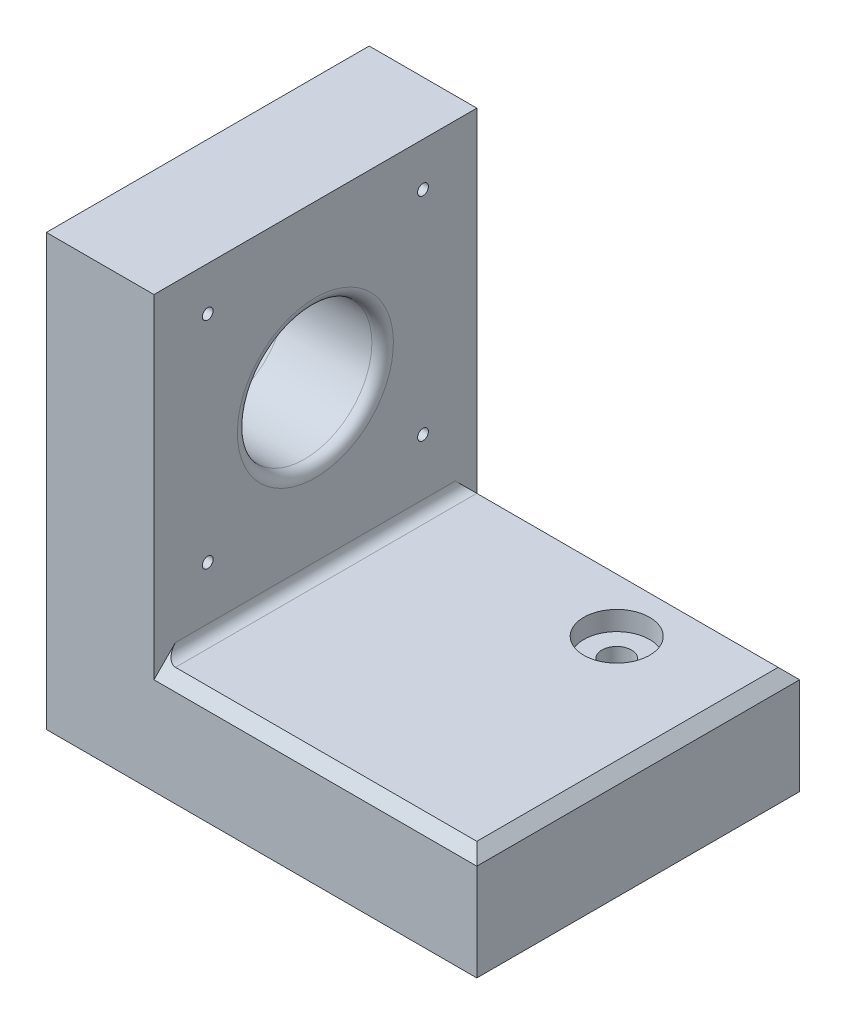
ISO-10303-21;
HEADER;
FILE_DESCRIPTION(('STEP AP214'),'2;1');
FILE_NAME('part.step','',(''),(''),'','','');
FILE_SCHEMA(('AUTOMOTIVE_DESIGN { 1 0 10303 214 1 1 1 1 }'));
ENDSEC;
DATA;
#1=APPLICATION_CONTEXT('core data for automotive mechanical design processes');
#2=APPLICATION_PROTOCOL_DEFINITION('international standard','automotive_design',2000,#1);
#3=PRODUCT_CONTEXT('',#1,'mechanical');
#4=PRODUCT('Part','Part','',(#3));
#5=PRODUCT_RELATED_PRODUCT_CATEGORY('part','',(#4));
#6=PRODUCT_DEFINITION_FORMATION('','',#4);
#7=PRODUCT_DEFINITION_CONTEXT('part definition',#1,'design');
#8=PRODUCT_DEFINITION('design','',#6,#7);
#9=PRODUCT_DEFINITION_SHAPE('','',#8);
#10=(LENGTH_UNIT() NAMED_UNIT(*) SI_UNIT(.MILLI.,.METRE.));
#11=(NAMED_UNIT(*) PLANE_ANGLE_UNIT() SI_UNIT($,.RADIAN.));
#12=(NAMED_UNIT(*) SI_UNIT($,.STERADIAN.) SOLID_ANGLE_UNIT());
#13=UNCERTAINTY_MEASURE_WITH_UNIT(LENGTH_MEASURE(1.E-05),#10,'distance_accuracy_value','');
#14=(GEOMETRIC_REPRESENTATION_CONTEXT(3) GLOBAL_UNCERTAINTY_ASSIGNED_CONTEXT((#13)) GLOBAL_UNIT_ASSIGNED_CONTEXT((#10,
#11,#12)) REPRESENTATION_CONTEXT('',''));
#15=CARTESIAN_POINT('',(0.,0.,0.));
#16=DIRECTION('',(0.,0.,1.));
#17=DIRECTION('',(1.,0.,0.));
#18=AXIS2_PLACEMENT_3D('',#15,#16,#17);
#19=CARTESIAN_POINT('',(80.,0.,-60.));
#20=DIRECTION('',(0.,-1.,0.));
#21=DIRECTION('',(1.,0.,0.));
#22=AXIS2_PLACEMENT_3D('',#19,#20,#21);
#23=PLANE('',#22);
#24=CARTESIAN_POINT('',(58.,0.,-48.));
#25=DIRECTION('',(0.,1.,0.));
#26=DIRECTION('',(0.,0.,1.));
#27=AXIS2_PLACEMENT_3D('',#24,#25,#26);
#28=CIRCLE('',#27,2.75);
#29=CARTESIAN_POINT('',(58.,0.,-45.25));
#30=VERTEX_POINT('',#29);
#31=EDGE_CURVE('E490',#30,#30,#28,.T.);
#32=ORIENTED_EDGE('',*,*,#31,.T.);
#33=EDGE_LOOP('',(#32));
#34=FACE_BOUND('',#33,.T.);
#35=DIRECTION('',(1.,0.,0.));
#36=VECTOR('',#35,1.);
#37=CARTESIAN_POINT('',(80.,0.,0.));
#38=LINE('',#37,#36);
#39=CARTESIAN_POINT('',(0.,0.,0.));
#40=VERTEX_POINT('',#39);
#41=CARTESIAN_POINT('',(80.,0.,0.));
#42=VERTEX_POINT('',#41);
#43=EDGE_CURVE('E142',#40,#42,#38,.T.);
#44=ORIENTED_EDGE('',*,*,#43,.F.);
#45=DIRECTION('',(0.,0.,1.));
#46=VECTOR('',#45,1.);
#47=CARTESIAN_POINT('',(0.,0.,-60.));
#48=LINE('',#47,#46);
#49=CARTESIAN_POINT('',(0.,0.,-60.));
#50=VERTEX_POINT('',#49);
#51=EDGE_CURVE('E156',#50,#40,#48,.T.);
#52=ORIENTED_EDGE('',*,*,#51,.F.);
#53=DIRECTION('',(1.,0.,0.));
#54=VECTOR('',#53,1.);
#55=CARTESIAN_POINT('',(80.,0.,-60.));
#56=LINE('',#55,#54);
#57=CARTESIAN_POINT('',(80.,0.,-60.));
#58=VERTEX_POINT('',#57);
#59=EDGE_CURVE('E155',#50,#58,#56,.T.);
#60=ORIENTED_EDGE('',*,*,#59,.T.);
#61=DIRECTION('',(0.,0.,1.));
#62=VECTOR('',#61,1.);
#63=CARTESIAN_POINT('',(80.,0.,-60.));
#64=LINE('',#63,#62);
#65=EDGE_CURVE('E163',#58,#42,#64,.T.);
#66=ORIENTED_EDGE('',*,*,#65,.T.);
#67=EDGE_LOOP('',(#44,#52,#60,#66));
#68=FACE_BOUND('',#67,.T.);
#69=ADVANCED_FACE('F39',(#34,#68),#23,.T.);
#70=CARTESIAN_POINT('',(0.,0.,-60.));
#71=DIRECTION('',(-1.,0.,0.));
#72=DIRECTION('',(0.,0.,1.));
#73=AXIS2_PLACEMENT_3D('',#70,#71,#72);
#74=PLANE('',#73);
#75=CARTESIAN_POINT('',(0.,50.,-30.));
#76=DIRECTION('',(-1.,0.,0.));
#77=DIRECTION('',(0.,0.,1.));
#78=AXIS2_PLACEMENT_3D('',#75,#76,#77);
#79=CIRCLE('',#78,14.5);
#80=CARTESIAN_POINT('',(0.,50.,-15.5));
#81=VERTEX_POINT('',#80);
#82=EDGE_CURVE('E158',#81,#81,#79,.F.);
#83=ORIENTED_EDGE('',*,*,#82,.T.);
#84=EDGE_LOOP('',(#83));
#85=FACE_BOUND('',#84,.T.);
#86=DIRECTION('',(0.,-1.,0.));
#87=VECTOR('',#86,1.);
#88=CARTESIAN_POINT('',(0.,0.,0.));
#89=LINE('',#88,#87);
#90=CARTESIAN_POINT('',(0.,80.,0.));
#91=VERTEX_POINT('',#90);
#92=EDGE_CURVE('E153',#91,#40,#89,.T.);
#93=ORIENTED_EDGE('',*,*,#92,.F.);
#94=DIRECTION('',(0.,0.,1.));
#95=VECTOR('',#94,1.);
#96=CARTESIAN_POINT('',(0.,80.,-60.));
#97=LINE('',#96,#95);
#98=CARTESIAN_POINT('',(0.,80.,-60.));
#99=VERTEX_POINT('',#98);
#100=EDGE_CURVE('E159',#99,#91,#97,.T.);
#101=ORIENTED_EDGE('',*,*,#100,.F.);
#102=DIRECTION('',(0.,-1.,0.));
#103=VECTOR('',#102,1.);
#104=CARTESIAN_POINT('',(0.,0.,-60.));
#105=LINE('',#104,#103);
#106=EDGE_CURVE('E165',#99,#50,#105,.T.);
#107=ORIENTED_EDGE('',*,*,#106,.T.);
#108=ORIENTED_EDGE('',*,*,#51,.T.);
#109=EDGE_LOOP('',(#93,#101,#107,#108));
#110=FACE_BOUND('',#109,.T.);
#111=ADVANCED_FACE('F236',(#85,#110),#74,.T.);
#112=CARTESIAN_POINT('',(0.,80.,-60.));
#113=DIRECTION('',(0.,1.,0.));
#114=DIRECTION('',(0.,0.,1.));
#115=AXIS2_PLACEMENT_3D('',#112,#113,#114);
#116=PLANE('',#115);
#117=DIRECTION('',(-1.,0.,0.));
#118=VECTOR('',#117,1.);
#119=CARTESIAN_POINT('',(0.,80.,0.));
#120=LINE('',#119,#118);
#121=CARTESIAN_POINT('',(20.,80.,0.));
#122=VERTEX_POINT('',#121);
#123=EDGE_CURVE('E145',#122,#91,#120,.T.);
#124=ORIENTED_EDGE('',*,*,#123,.F.);
#125=DIRECTION('',(0.,0.,1.));
#126=VECTOR('',#125,1.);
#127=CARTESIAN_POINT('',(20.,80.,-60.));
#128=LINE('',#127,#126);
#129=CARTESIAN_POINT('',(20.,80.,-60.));
#130=VERTEX_POINT('',#129);
#131=EDGE_CURVE('E161',#130,#122,#128,.T.);
#132=ORIENTED_EDGE('',*,*,#131,.F.);
#133=DIRECTION('',(-1.,0.,0.));
#134=VECTOR('',#133,1.);
#135=CARTESIAN_POINT('',(0.,80.,-60.));
#136=LINE('',#135,#134);
#137=EDGE_CURVE('E230',#130,#99,#136,.T.);
#138=ORIENTED_EDGE('',*,*,#137,.T.);
#139=ORIENTED_EDGE('',*,*,#100,.T.);
#140=EDGE_LOOP('',(#124,#132,#138,#139));
#141=FACE_BOUND('',#140,.T.);
#142=ADVANCED_FACE('F244',(#141),#116,.T.);
#143=CARTESIAN_POINT('',(20.,80.,-60.));
#144=DIRECTION('',(1.,0.,0.));
#145=DIRECTION('',(0.,1.,0.));
#146=AXIS2_PLACEMENT_3D('',#143,#144,#145);
#147=PLANE('',#146);
#148=CARTESIAN_POINT('',(20.,50.,-30.));
#149=DIRECTION('',(1.,0.,0.));
#150=DIRECTION('',(0.,1.,0.));
#151=AXIS2_PLACEMENT_3D('',#148,#149,#150);
#152=CIRCLE('',#151,14.5);
#153=CARTESIAN_POINT('',(20.,64.5,-30.));
#154=VERTEX_POINT('',#153);
#155=EDGE_CURVE('E174',#154,#154,#152,.F.);
#156=ORIENTED_EDGE('',*,*,#155,.T.);
#157=EDGE_LOOP('',(#156));
#158=FACE_BOUND('',#157,.T.);
#159=CARTESIAN_POINT('',(20.,71.900619729754,-10.));
#160=DIRECTION('',(1.,0.,0.));
#161=DIRECTION('',(0.,0.,-1.));
#162=AXIS2_PLACEMENT_3D('',#159,#160,#161);
#163=CIRCLE('',#162,1.);
#164=CARTESIAN_POINT('',(20.,71.900619729754,-11.));
#165=VERTEX_POINT('',#164);
#166=EDGE_CURVE('E208',#165,#165,#163,.T.);
#167=ORIENTED_EDGE('',*,*,#166,.F.);
#168=EDGE_LOOP('',(#167));
#169=FACE_BOUND('',#168,.T.);
#170=CARTESIAN_POINT('',(20.,32.4695679521847,-50.));
#171=DIRECTION('',(1.,0.,0.));
#172=DIRECTION('',(0.,0.,-1.));
#173=AXIS2_PLACEMENT_3D('',#170,#171,#172);
#174=CIRCLE('',#173,0.999999999999998);
#175=CARTESIAN_POINT('',(20.,32.4695679521847,-51.));
#176=VERTEX_POINT('',#175);
#177=EDGE_CURVE('E207',#176,#176,#174,.T.);
#178=ORIENTED_EDGE('',*,*,#177,.F.);
#179=EDGE_LOOP('',(#178));
#180=FACE_BOUND('',#179,.T.);
#181=CARTESIAN_POINT('',(20.,31.900619729754,-10.));
#182=DIRECTION('',(1.,0.,0.));
#183=DIRECTION('',(0.,0.,-1.));
#184=AXIS2_PLACEMENT_3D('',#181,#182,#183);
#185=CIRCLE('',#184,1.);
#186=CARTESIAN_POINT('',(20.,31.900619729754,-11.));
#187=VERTEX_POINT('',#186);
#188=EDGE_CURVE('E195',#187,#187,#185,.T.);
#189=ORIENTED_EDGE('',*,*,#188,.F.);
#190=EDGE_LOOP('',(#189));
#191=FACE_BOUND('',#190,.T.);
#192=CARTESIAN_POINT('',(20.,71.900619729754,-50.));
#193=DIRECTION('',(1.,0.,0.));
#194=DIRECTION('',(0.,0.,-1.));
#195=AXIS2_PLACEMENT_3D('',#192,#193,#194);
#196=CIRCLE('',#195,0.999999999999998);
#197=CARTESIAN_POINT('',(20.,71.900619729754,-51.));
#198=VERTEX_POINT('',#197);
#199=EDGE_CURVE('E215',#198,#198,#196,.T.);
#200=ORIENTED_EDGE('',*,*,#199,.F.);
#201=EDGE_LOOP('',(#200));
#202=FACE_BOUND('',#201,.T.);
#203=DIRECTION('',(0.,0.707106781186547,-0.707106781186548));
#204=VECTOR('',#203,1.);
#205=CARTESIAN_POINT('',(20.,20.,-2.));
#206=LINE('',#205,#204);
#207=CARTESIAN_POINT('',(20.,18.,0.));
#208=VERTEX_POINT('',#207);
#209=CARTESIAN_POINT('',(20.,22.,-4.));
#210=VERTEX_POINT('',#209);
#211=EDGE_CURVE('E54',#208,#210,#206,.T.);
#212=ORIENTED_EDGE('',*,*,#211,.T.);
#213=DIRECTION('',(0.,0.,1.));
#214=VECTOR('',#213,1.);
#215=CARTESIAN_POINT('',(20.,22.,-58.));
#216=LINE('',#215,#214);
#217=CARTESIAN_POINT('',(20.,22.,-56.));
#218=VERTEX_POINT('',#217);
#219=EDGE_CURVE('E180',#210,#218,#216,.F.);
#220=ORIENTED_EDGE('',*,*,#219,.T.);
#221=DIRECTION('',(0.,-0.707106781186547,-0.707106781186548));
#222=VECTOR('',#221,1.);
#223=CARTESIAN_POINT('',(20.,20.,-58.));
#224=LINE('',#223,#222);
#225=CARTESIAN_POINT('',(20.,18.,-60.));
#226=VERTEX_POINT('',#225);
#227=EDGE_CURVE('E62',#218,#226,#224,.T.);
#228=ORIENTED_EDGE('',*,*,#227,.T.);
#229=DIRECTION('',(0.,1.,0.));
#230=VECTOR('',#229,1.);
#231=CARTESIAN_POINT('',(20.,80.,-60.));
#232=LINE('',#231,#230);
#233=EDGE_CURVE('E227',#226,#130,#232,.T.);
#234=ORIENTED_EDGE('',*,*,#233,.T.);
#235=ORIENTED_EDGE('',*,*,#131,.T.);
#236=DIRECTION('',(0.,1.,0.));
#237=VECTOR('',#236,1.);
#238=CARTESIAN_POINT('',(20.,80.,0.));
#239=LINE('',#238,#237);
#240=EDGE_CURVE('E143',#208,#122,#239,.T.);
#241=ORIENTED_EDGE('',*,*,#240,.F.);
#242=EDGE_LOOP('',(#212,#220,#228,#234,#235,#241));
#243=FACE_BOUND('',#242,.T.);
#244=ADVANCED_FACE('F245',(#158,#169,#180,#191,#202,#243),#147,.T.);
#245=CARTESIAN_POINT('',(20.,20.,-60.));
#246=DIRECTION('',(0.,1.,0.));
#247=DIRECTION('',(0.,0.,1.));
#248=AXIS2_PLACEMENT_3D('',#245,#246,#247);
#249=PLANE('',#248);
#250=CARTESIAN_POINT('',(58.,20.,-48.));
#251=DIRECTION('',(0.,1.,0.));
#252=DIRECTION('',(0.,0.,1.));
#253=AXIS2_PLACEMENT_3D('',#250,#251,#252);
#254=CIRCLE('',#253,6.12);
#255=CARTESIAN_POINT('',(58.,20.,-54.12));
#256=VERTEX_POINT('',#255);
#257=EDGE_CURVE('E491',#256,#256,#254,.T.);
#258=ORIENTED_EDGE('',*,*,#257,.F.);
#259=EDGE_LOOP('',(#258));
#260=FACE_BOUND('',#259,.T.);
#261=DIRECTION('',(0.,0.,1.));
#262=VECTOR('',#261,1.);
#263=CARTESIAN_POINT('',(78.,20.,-60.));
#264=LINE('',#263,#262);
#265=CARTESIAN_POINT('',(78.,20.,-58.));
#266=VERTEX_POINT('',#265);
#267=CARTESIAN_POINT('',(78.,20.,-2.));
#268=VERTEX_POINT('',#267);
#269=EDGE_CURVE('E115',#266,#268,#264,.T.);
#270=ORIENTED_EDGE('',*,*,#269,.F.);
#271=DIRECTION('',(1.,0.,0.));
#272=VECTOR('',#271,1.);
#273=CARTESIAN_POINT('',(20.,20.,-58.));
#274=LINE('',#273,#272);
#275=CARTESIAN_POINT('',(22.,20.,-58.));
#276=VERTEX_POINT('',#275);
#277=EDGE_CURVE('E187',#276,#266,#274,.T.);
#278=ORIENTED_EDGE('',*,*,#277,.F.);
#279=DIRECTION('',(0.,0.,1.));
#280=VECTOR('',#279,1.);
#281=CARTESIAN_POINT('',(22.,20.,-2.));
#282=LINE('',#281,#280);
#283=CARTESIAN_POINT('',(22.,20.,-2.));
#284=VERTEX_POINT('',#283);
#285=EDGE_CURVE('E177',#276,#284,#282,.T.);
#286=ORIENTED_EDGE('',*,*,#285,.T.);
#287=DIRECTION('',(1.,0.,0.));
#288=VECTOR('',#287,1.);
#289=CARTESIAN_POINT('',(20.,20.,-2.));
#290=LINE('',#289,#288);
#291=EDGE_CURVE('E137',#284,#268,#290,.T.);
#292=ORIENTED_EDGE('',*,*,#291,.T.);
#293=EDGE_LOOP('',(#270,#278,#286,#292));
#294=FACE_BOUND('',#293,.T.);
#295=ADVANCED_FACE('F192',(#260,#294),#249,.T.);
#296=CARTESIAN_POINT('',(80.,20.,-60.));
#297=DIRECTION('',(1.,0.,0.));
#298=DIRECTION('',(0.,0.,-1.));
#299=AXIS2_PLACEMENT_3D('',#296,#297,#298);
#300=PLANE('',#299);
#301=DIRECTION('',(0.,0.,1.));
#302=VECTOR('',#301,1.);
#303=CARTESIAN_POINT('',(80.,18.,-60.));
#304=LINE('',#303,#302);
#305=CARTESIAN_POINT('',(80.,18.,-60.));
#306=VERTEX_POINT('',#305);
#307=CARTESIAN_POINT('',(80.,18.,0.));
#308=VERTEX_POINT('',#307);
#309=EDGE_CURVE('E113',#306,#308,#304,.T.);
#310=ORIENTED_EDGE('',*,*,#309,.T.);
#311=DIRECTION('',(0.,1.,0.));
#312=VECTOR('',#311,1.);
#313=CARTESIAN_POINT('',(80.,20.,0.));
#314=LINE('',#313,#312);
#315=EDGE_CURVE('E126',#42,#308,#314,.T.);
#316=ORIENTED_EDGE('',*,*,#315,.F.);
#317=ORIENTED_EDGE('',*,*,#65,.F.);
#318=DIRECTION('',(0.,1.,0.));
#319=VECTOR('',#318,1.);
#320=CARTESIAN_POINT('',(80.,20.,-60.));
#321=LINE('',#320,#319);
#322=EDGE_CURVE('E129',#58,#306,#321,.T.);
#323=ORIENTED_EDGE('',*,*,#322,.T.);
#324=EDGE_LOOP('',(#310,#316,#317,#323));
#325=FACE_BOUND('',#324,.T.);
#326=ADVANCED_FACE('F124',(#325),#300,.T.);
#327=CARTESIAN_POINT('',(0.,0.,-60.));
#328=DIRECTION('',(0.,0.,-1.));
#329=DIRECTION('',(-1.,0.,0.));
#330=AXIS2_PLACEMENT_3D('',#327,#328,#329);
#331=PLANE('',#330);
#332=DIRECTION('',(1.,0.,0.));
#333=VECTOR('',#332,1.);
#334=CARTESIAN_POINT('',(20.,18.,-60.));
#335=LINE('',#334,#333);
#336=EDGE_CURVE('E193',#226,#306,#335,.T.);
#337=ORIENTED_EDGE('',*,*,#336,.T.);
#338=ORIENTED_EDGE('',*,*,#322,.F.);
#339=ORIENTED_EDGE('',*,*,#59,.F.);
#340=ORIENTED_EDGE('',*,*,#106,.F.);
#341=ORIENTED_EDGE('',*,*,#137,.F.);
#342=ORIENTED_EDGE('',*,*,#233,.F.);
#343=EDGE_LOOP('',(#337,#338,#339,#340,#341,#342));
#344=FACE_BOUND('',#343,.T.);
#345=ADVANCED_FACE('F240',(#344),#331,.T.);
#346=CARTESIAN_POINT('',(0.,0.,0.));
#347=DIRECTION('',(0.,0.,-1.));
#348=DIRECTION('',(-1.,0.,0.));
#349=AXIS2_PLACEMENT_3D('',#346,#347,#348);
#350=PLANE('',#349);
#351=ORIENTED_EDGE('',*,*,#315,.T.);
#352=DIRECTION('',(1.,0.,0.));
#353=VECTOR('',#352,1.);
#354=CARTESIAN_POINT('',(20.,18.,0.));
#355=LINE('',#354,#353);
#356=EDGE_CURVE('E133',#208,#308,#355,.T.);
#357=ORIENTED_EDGE('',*,*,#356,.F.);
#358=ORIENTED_EDGE('',*,*,#240,.T.);
#359=ORIENTED_EDGE('',*,*,#123,.T.);
#360=ORIENTED_EDGE('',*,*,#92,.T.);
#361=ORIENTED_EDGE('',*,*,#43,.T.);
#362=EDGE_LOOP('',(#351,#357,#358,#359,#360,#361));
#363=FACE_BOUND('',#362,.T.);
#364=ADVANCED_FACE('F139',(#363),#350,.F.);
#365=CARTESIAN_POINT('',(10.,0.,0.));
#366=DIRECTION('',(-1.,0.,0.));
#367=DIRECTION('',(0.,0.,1.));
#368=AXIS2_PLACEMENT_3D('',#365,#366,#367);
#369=PLANE('',#368);
#370=CARTESIAN_POINT('',(10.,71.900619729754,-50.));
#371=DIRECTION('',(1.,0.,0.));
#372=DIRECTION('',(0.,0.,-1.));
#373=AXIS2_PLACEMENT_3D('',#370,#371,#372);
#374=CIRCLE('',#373,0.999999999999998);
#375=CARTESIAN_POINT('',(10.,71.900619729754,-51.));
#376=VERTEX_POINT('',#375);
#377=EDGE_CURVE('E147',#376,#376,#374,.T.);
#378=ORIENTED_EDGE('',*,*,#377,.T.);
#379=EDGE_LOOP('',(#378));
#380=FACE_BOUND('',#379,.T.);
#381=ADVANCED_FACE('F315',(#380),#369,.F.);
#382=CARTESIAN_POINT('',(20.,71.900619729754,-50.));
#383=DIRECTION('',(-1.,0.,0.));
#384=DIRECTION('',(0.,-1.,0.));
#385=AXIS2_PLACEMENT_3D('',#382,#383,#384);
#386=CYLINDRICAL_SURFACE('',#385,0.999999999999998);
#387=ORIENTED_EDGE('',*,*,#199,.T.);
#388=EDGE_LOOP('',(#387));
#389=FACE_BOUND('',#388,.T.);
#390=ORIENTED_EDGE('',*,*,#377,.F.);
#391=EDGE_LOOP('',(#390));
#392=FACE_BOUND('',#391,.T.);
#393=ADVANCED_FACE('F312',(#389,#392),#386,.F.);
#394=CARTESIAN_POINT('',(10.,0.,0.));
#395=DIRECTION('',(-1.,0.,0.));
#396=DIRECTION('',(0.,0.,1.));
#397=AXIS2_PLACEMENT_3D('',#394,#395,#396);
#398=PLANE('',#397);
#399=CARTESIAN_POINT('',(10.,31.900619729754,-10.));
#400=DIRECTION('',(1.,0.,0.));
#401=DIRECTION('',(0.,0.,-1.));
#402=AXIS2_PLACEMENT_3D('',#399,#400,#401);
#403=CIRCLE('',#402,1.);
#404=CARTESIAN_POINT('',(10.,31.900619729754,-11.));
#405=VERTEX_POINT('',#404);
#406=EDGE_CURVE('E198',#405,#405,#403,.T.);
#407=ORIENTED_EDGE('',*,*,#406,.T.);
#408=EDGE_LOOP('',(#407));
#409=FACE_BOUND('',#408,.T.);
#410=ADVANCED_FACE('F305',(#409),#398,.F.);
#411=CARTESIAN_POINT('',(20.,31.900619729754,-10.));
#412=DIRECTION('',(-1.,0.,0.));
#413=DIRECTION('',(0.,-1.,0.));
#414=AXIS2_PLACEMENT_3D('',#411,#412,#413);
#415=CYLINDRICAL_SURFACE('',#414,1.);
#416=ORIENTED_EDGE('',*,*,#188,.T.);
#417=EDGE_LOOP('',(#416));
#418=FACE_BOUND('',#417,.T.);
#419=ORIENTED_EDGE('',*,*,#406,.F.);
#420=EDGE_LOOP('',(#419));
#421=FACE_BOUND('',#420,.T.);
#422=ADVANCED_FACE('F310',(#418,#421),#415,.F.);
#423=CARTESIAN_POINT('',(10.,0.,0.));
#424=DIRECTION('',(-1.,0.,0.));
#425=DIRECTION('',(0.,0.,1.));
#426=AXIS2_PLACEMENT_3D('',#423,#424,#425);
#427=PLANE('',#426);
#428=CARTESIAN_POINT('',(10.,32.4695679521847,-50.));
#429=DIRECTION('',(1.,0.,0.));
#430=DIRECTION('',(0.,0.,-1.));
#431=AXIS2_PLACEMENT_3D('',#428,#429,#430);
#432=CIRCLE('',#431,0.999999999999998);
#433=CARTESIAN_POINT('',(10.,32.4695679521847,-51.));
#434=VERTEX_POINT('',#433);
#435=EDGE_CURVE('E212',#434,#434,#432,.T.);
#436=ORIENTED_EDGE('',*,*,#435,.T.);
#437=EDGE_LOOP('',(#436));
#438=FACE_BOUND('',#437,.T.);
#439=ADVANCED_FACE('F293',(#438),#427,.F.);
#440=CARTESIAN_POINT('',(20.,32.4695679521847,-50.));
#441=DIRECTION('',(-1.,0.,0.));
#442=DIRECTION('',(0.,-1.,0.));
#443=AXIS2_PLACEMENT_3D('',#440,#441,#442);
#444=CYLINDRICAL_SURFACE('',#443,0.999999999999998);
#445=ORIENTED_EDGE('',*,*,#177,.T.);
#446=EDGE_LOOP('',(#445));
#447=FACE_BOUND('',#446,.T.);
#448=ORIENTED_EDGE('',*,*,#435,.F.);
#449=EDGE_LOOP('',(#448));
#450=FACE_BOUND('',#449,.T.);
#451=ADVANCED_FACE('F297',(#447,#450),#444,.F.);
#452=CARTESIAN_POINT('',(10.,0.,0.));
#453=DIRECTION('',(-1.,0.,0.));
#454=DIRECTION('',(0.,0.,1.));
#455=AXIS2_PLACEMENT_3D('',#452,#453,#454);
#456=PLANE('',#455);
#457=CARTESIAN_POINT('',(10.,71.900619729754,-10.));
#458=DIRECTION('',(1.,0.,0.));
#459=DIRECTION('',(0.,0.,-1.));
#460=AXIS2_PLACEMENT_3D('',#457,#458,#459);
#461=CIRCLE('',#460,1.);
#462=CARTESIAN_POINT('',(10.,71.900619729754,-11.));
#463=VERTEX_POINT('',#462);
#464=EDGE_CURVE('E211',#463,#463,#461,.T.);
#465=ORIENTED_EDGE('',*,*,#464,.T.);
#466=EDGE_LOOP('',(#465));
#467=FACE_BOUND('',#466,.T.);
#468=ADVANCED_FACE('F287',(#467),#456,.F.);
#469=CARTESIAN_POINT('',(20.,71.900619729754,-10.));
#470=DIRECTION('',(-1.,0.,0.));
#471=DIRECTION('',(0.,-1.,0.));
#472=AXIS2_PLACEMENT_3D('',#469,#470,#471);
#473=CYLINDRICAL_SURFACE('',#472,1.);
#474=ORIENTED_EDGE('',*,*,#166,.T.);
#475=EDGE_LOOP('',(#474));
#476=FACE_BOUND('',#475,.T.);
#477=ORIENTED_EDGE('',*,*,#464,.F.);
#478=EDGE_LOOP('',(#477));
#479=FACE_BOUND('',#478,.T.);
#480=ADVANCED_FACE('F284',(#476,#479),#473,.F.);
#481=CARTESIAN_POINT('',(20.,50.,-30.));
#482=DIRECTION('',(-1.,0.,0.));
#483=DIRECTION('',(0.,-1.,0.));
#484=AXIS2_PLACEMENT_3D('',#481,#482,#483);
#485=CYLINDRICAL_SURFACE('',#484,12.5);
#486=CARTESIAN_POINT('',(2.,50.,-30.));
#487=DIRECTION('',(-1.,0.,0.));
#488=DIRECTION('',(0.,0.,1.));
#489=AXIS2_PLACEMENT_3D('',#486,#487,#488);
#490=CIRCLE('',#489,12.5);
#491=CARTESIAN_POINT('',(2.,37.5,-30.));
#492=VERTEX_POINT('',#491);
#493=EDGE_CURVE('E171',#492,#492,#490,.T.);
#494=CARTESIAN_POINT('',(18.,50.,-30.));
#495=DIRECTION('',(1.,0.,0.));
#496=DIRECTION('',(0.,1.,0.));
#497=AXIS2_PLACEMENT_3D('',#494,#495,#496);
#498=CIRCLE('',#497,12.5);
#499=CARTESIAN_POINT('',(18.,37.5,-30.));
#500=VERTEX_POINT('',#499);
#501=EDGE_CURVE('E168',#500,#500,#498,.T.);
#502=CARTESIAN_POINT('',(2.,37.5,-30.));
#503=CARTESIAN_POINT('',(2.16666666666667,37.5,-30.));
#504=CARTESIAN_POINT('',(2.33333333333334,37.5,-30.));
#505=CARTESIAN_POINT('',(2.66666666666667,37.5,-30.));
#506=CARTESIAN_POINT('',(2.83333333333334,37.5,-30.));
#507=CARTESIAN_POINT('',(3.16666666666667,37.5,-30.));
#508=CARTESIAN_POINT('',(3.33333333333334,37.5,-30.));
#509=CARTESIAN_POINT('',(3.66666666666667,37.5,-30.));
#510=CARTESIAN_POINT('',(3.83333333333334,37.5,-30.));
#511=CARTESIAN_POINT('',(4.16666666666667,37.5,-30.));
#512=CARTESIAN_POINT('',(4.33333333333334,37.5,-30.));
#513=CARTESIAN_POINT('',(4.66666666666667,37.5,-30.));
#514=CARTESIAN_POINT('',(4.83333333333333,37.5,-30.));
#515=CARTESIAN_POINT('',(5.16666666666667,37.5,-30.));
#516=CARTESIAN_POINT('',(5.33333333333333,37.5,-30.));
#517=CARTESIAN_POINT('',(5.66666666666667,37.5,-30.));
#518=CARTESIAN_POINT('',(5.83333333333334,37.5,-30.));
#519=CARTESIAN_POINT('',(6.16666666666667,37.5,-30.));
#520=CARTESIAN_POINT('',(6.33333333333334,37.5,-30.));
#521=CARTESIAN_POINT('',(6.66666666666667,37.5,-30.));
#522=CARTESIAN_POINT('',(6.83333333333334,37.5,-30.));
#523=CARTESIAN_POINT('',(7.16666666666667,37.5,-30.));
#524=CARTESIAN_POINT('',(7.33333333333333,37.5,-30.));
#525=CARTESIAN_POINT('',(7.66666666666667,37.5,-30.));
#526=CARTESIAN_POINT('',(7.83333333333333,37.5,-30.));
#527=CARTESIAN_POINT('',(8.16666666666667,37.5,-30.));
#528=CARTESIAN_POINT('',(8.33333333333334,37.5,-30.));
#529=CARTESIAN_POINT('',(8.66666666666667,37.5,-30.));
#530=CARTESIAN_POINT('',(8.83333333333334,37.5,-30.));
#531=CARTESIAN_POINT('',(9.16666666666667,37.5,-30.));
#532=CARTESIAN_POINT('',(9.33333333333334,37.5,-30.));
#533=CARTESIAN_POINT('',(9.66666666666667,37.5,-30.));
#534=CARTESIAN_POINT('',(9.83333333333334,37.5,-30.));
#535=CARTESIAN_POINT('',(10.1666666666667,37.5,-30.));
#536=CARTESIAN_POINT('',(10.3333333333333,37.5,-30.));
#537=CARTESIAN_POINT('',(10.6666666666667,37.5,-30.));
#538=CARTESIAN_POINT('',(10.8333333333333,37.5,-30.));
#539=CARTESIAN_POINT('',(11.1666666666667,37.5,-30.));
#540=CARTESIAN_POINT('',(11.3333333333333,37.5,-30.));
#541=CARTESIAN_POINT('',(11.6666666666667,37.5,-30.));
#542=CARTESIAN_POINT('',(11.8333333333333,37.5,-30.));
#543=CARTESIAN_POINT('',(12.1666666666667,37.5,-30.));
#544=CARTESIAN_POINT('',(12.3333333333333,37.5,-30.));
#545=CARTESIAN_POINT('',(12.6666666666667,37.5,-30.));
#546=CARTESIAN_POINT('',(12.8333333333333,37.5,-30.));
#547=CARTESIAN_POINT('',(13.1666666666667,37.5,-30.));
#548=CARTESIAN_POINT('',(13.3333333333333,37.5,-30.));
#549=CARTESIAN_POINT('',(13.6666666666667,37.5,-30.));
#550=CARTESIAN_POINT('',(13.8333333333333,37.5,-30.));
#551=CARTESIAN_POINT('',(14.1666666666667,37.5,-30.));
#552=CARTESIAN_POINT('',(14.3333333333333,37.5,-30.));
#553=CARTESIAN_POINT('',(14.6666666666667,37.5,-30.));
#554=CARTESIAN_POINT('',(14.8333333333333,37.5,-30.));
#555=CARTESIAN_POINT('',(15.1666666666667,37.5,-30.));
#556=CARTESIAN_POINT('',(15.3333333333333,37.5,-30.));
#557=CARTESIAN_POINT('',(15.6666666666667,37.5,-30.));
#558=CARTESIAN_POINT('',(15.8333333333333,37.5,-30.));
#559=CARTESIAN_POINT('',(16.1666666666667,37.5,-30.));
#560=CARTESIAN_POINT('',(16.3333333333333,37.5,-30.));
#561=CARTESIAN_POINT('',(16.6666666666667,37.5,-30.));
#562=CARTESIAN_POINT('',(16.8333333333333,37.5,-30.));
#563=CARTESIAN_POINT('',(17.1666666666667,37.5,-30.));
#564=CARTESIAN_POINT('',(17.3333333333333,37.5,-30.));
#565=CARTESIAN_POINT('',(17.6666666666667,37.5,-30.));
#566=CARTESIAN_POINT('',(17.8333333333333,37.5,-30.));
#567=CARTESIAN_POINT('',(18.,37.5,-30.));
#568=B_SPLINE_CURVE_WITH_KNOTS('',3,(#502,#503,#504,#505,#506,#507,#508,#509,#510,#511,#512,
#513,#514,#515,#516,#517,#518,#519,#520,#521,#522,#523,#524,#525,#526,#527,#528,#529,#530,#531,
#532,#533,#534,#535,#536,#537,#538,#539,#540,#541,#542,#543,#544,#545,#546,#547,#548,#549,#550,
#551,#552,#553,#554,#555,#556,#557,#558,#559,#560,#561,#562,#563,#564,#565,#566,#567),
.UNSPECIFIED.,.F.,.F.,(4,2,2,2,2,2,2,2,2,2,2,2,2,2,2,2,2,2,2,2,2,2,2,2,2,2,2,2,2,2,2,2,4),(0.,
0.5,1.,1.5,2.,2.5,3.,3.5,4.,4.5,5.,5.5,6.,6.5,7.,7.5,8.,8.5,9.,9.5,10.,10.5,11.,11.5,12.,12.5,
13.,13.5,14.,14.5,15.,15.5,16.),.UNSPECIFIED.);
#569=EDGE_CURVE('BSEAM271',#492,#500,#568,.T.);
#570=ORIENTED_EDGE('',*,*,#493,.T.);
#571=ORIENTED_EDGE('',*,*,#501,.T.);
#572=ORIENTED_EDGE('',*,*,#569,.T.);
#573=ORIENTED_EDGE('',*,*,#569,.F.);
#574=EDGE_LOOP('',(#570,#572,#571,#573));
#575=FACE_BOUND('',#574,.T.);
#576=ADVANCED_FACE('F271',(#575),#485,.F.);
#577=CARTESIAN_POINT('',(2.,50.,-30.));
#578=DIRECTION('',(-1.,0.,0.));
#579=DIRECTION('',(0.,0.,1.));
#580=AXIS2_PLACEMENT_3D('',#577,#578,#579);
#581=TOROIDAL_SURFACE('',#580,14.5,2.);
#582=ORIENTED_EDGE('',*,*,#493,.F.);
#583=EDGE_LOOP('',(#582));
#584=FACE_BOUND('',#583,.T.);
#585=ORIENTED_EDGE('',*,*,#82,.F.);
#586=EDGE_LOOP('',(#585));
#587=FACE_BOUND('',#586,.T.);
#588=ADVANCED_FACE('F268',(#584,#587),#581,.T.);
#589=CARTESIAN_POINT('',(18.,50.,-30.));
#590=DIRECTION('',(1.,0.,0.));
#591=DIRECTION('',(0.,1.,0.));
#592=AXIS2_PLACEMENT_3D('',#589,#590,#591);
#593=TOROIDAL_SURFACE('',#592,14.5,2.);
#594=ORIENTED_EDGE('',*,*,#155,.F.);
#595=EDGE_LOOP('',(#594));
#596=FACE_BOUND('',#595,.T.);
#597=ORIENTED_EDGE('',*,*,#501,.F.);
#598=EDGE_LOOP('',(#597));
#599=FACE_BOUND('',#598,.T.);
#600=ADVANCED_FACE('F270',(#596,#599),#593,.T.);
#601=CARTESIAN_POINT('',(20.,20.,-2.));
#602=DIRECTION('',(0.,-0.707106781186548,-0.707106781186547));
#603=DIRECTION('',(0.,0.707106781186547,-0.707106781186548));
#604=AXIS2_PLACEMENT_3D('',#601,#602,#603);
#605=PLANE('',#604);
#606=ORIENTED_EDGE('',*,*,#356,.T.);
#607=DIRECTION('',(-0.577350269189626,0.577350269189625,-0.577350269189626));
#608=VECTOR('',#607,1.);
#609=CARTESIAN_POINT('',(58.6666666666666,39.3333333333333,-21.3333333333333));
#610=LINE('',#609,#608);
#611=EDGE_CURVE('E110',#308,#268,#610,.T.);
#612=ORIENTED_EDGE('',*,*,#611,.T.);
#613=ORIENTED_EDGE('',*,*,#291,.F.);
#614=CARTESIAN_POINT('',(22.,22.,-4.));
#615=DIRECTION('',(0.,-0.707106781186548,-0.707106781186547));
#616=DIRECTION('',(0.,0.707106781186547,-0.707106781186548));
#617=AXIS2_PLACEMENT_3D('',#614,#615,#616);
#618=ELLIPSE('',#617,2.82842712474619,2.);
#619=EDGE_CURVE('E182',#284,#210,#618,.T.);
#620=ORIENTED_EDGE('',*,*,#619,.T.);
#621=ORIENTED_EDGE('',*,*,#211,.F.);
#622=EDGE_LOOP('',(#606,#612,#613,#620,#621));
#623=FACE_BOUND('',#622,.T.);
#624=ADVANCED_FACE('F134',(#623),#605,.F.);
#625=CARTESIAN_POINT('',(20.,20.,-58.));
#626=DIRECTION('',(0.,-0.707106781186548,0.707106781186547));
#627=DIRECTION('',(0.,-0.707106781186547,-0.707106781186548));
#628=AXIS2_PLACEMENT_3D('',#625,#626,#627);
#629=PLANE('',#628);
#630=ORIENTED_EDGE('',*,*,#277,.T.);
#631=DIRECTION('',(0.577350269189626,-0.577350269189625,-0.577350269189626));
#632=VECTOR('',#631,1.);
#633=CARTESIAN_POINT('',(58.6666666666666,39.3333333333333,-38.6666666666666));
#634=LINE('',#633,#632);
#635=EDGE_CURVE('E12',#266,#306,#634,.T.);
#636=ORIENTED_EDGE('',*,*,#635,.T.);
#637=ORIENTED_EDGE('',*,*,#336,.F.);
#638=ORIENTED_EDGE('',*,*,#227,.F.);
#639=CARTESIAN_POINT('',(22.,22.,-56.));
#640=DIRECTION('',(0.,-0.707106781186548,0.707106781186547));
#641=DIRECTION('',(0.,-0.707106781186547,-0.707106781186548));
#642=AXIS2_PLACEMENT_3D('',#639,#640,#641);
#643=ELLIPSE('',#642,2.82842712474619,2.);
#644=EDGE_CURVE('E47',#218,#276,#643,.T.);
#645=ORIENTED_EDGE('',*,*,#644,.T.);
#646=EDGE_LOOP('',(#630,#636,#637,#638,#645));
#647=FACE_BOUND('',#646,.T.);
#648=ADVANCED_FACE('F186',(#647),#629,.F.);
#649=CARTESIAN_POINT('',(22.,22.,-60.));
#650=DIRECTION('',(0.,0.,-1.));
#651=DIRECTION('',(-1.,0.,0.));
#652=AXIS2_PLACEMENT_3D('',#649,#650,#651);
#653=CYLINDRICAL_SURFACE('',#652,2.);
#654=ORIENTED_EDGE('',*,*,#644,.F.);
#655=ORIENTED_EDGE('',*,*,#219,.F.);
#656=ORIENTED_EDGE('',*,*,#619,.F.);
#657=ORIENTED_EDGE('',*,*,#285,.F.);
#658=EDGE_LOOP('',(#654,#655,#656,#657));
#659=FACE_BOUND('',#658,.T.);
#660=ADVANCED_FACE('F41',(#659),#653,.F.);
#661=CARTESIAN_POINT('',(80.,18.,-60.));
#662=DIRECTION('',(-0.707106781186547,-0.707106781186548,0.));
#663=DIRECTION('',(0.707106781186548,-0.707106781186547,0.));
#664=AXIS2_PLACEMENT_3D('',#661,#662,#663);
#665=PLANE('',#664);
#666=ORIENTED_EDGE('',*,*,#309,.F.);
#667=ORIENTED_EDGE('',*,*,#635,.F.);
#668=ORIENTED_EDGE('',*,*,#269,.T.);
#669=ORIENTED_EDGE('',*,*,#611,.F.);
#670=EDGE_LOOP('',(#666,#667,#668,#669));
#671=FACE_BOUND('',#670,.T.);
#672=ADVANCED_FACE('F112',(#671),#665,.F.);
#673=CARTESIAN_POINT('',(0.,16.42,0.));
#674=DIRECTION('',(0.,-1.,0.));
#675=DIRECTION('',(0.,0.,-1.));
#676=AXIS2_PLACEMENT_3D('',#673,#674,#675);
#677=PLANE('',#676);
#678=CARTESIAN_POINT('',(58.,16.42,-48.));
#679=DIRECTION('',(0.,1.,0.));
#680=DIRECTION('',(0.,0.,1.));
#681=AXIS2_PLACEMENT_3D('',#678,#679,#680);
#682=CIRCLE('',#681,2.75);
#683=CARTESIAN_POINT('',(58.,16.42,-45.25));
#684=VERTEX_POINT('',#683);
#685=EDGE_CURVE('E488',#684,#684,#682,.T.);
#686=ORIENTED_EDGE('',*,*,#685,.F.);
#687=EDGE_LOOP('',(#686));
#688=FACE_BOUND('',#687,.T.);
#689=CARTESIAN_POINT('',(58.,16.42,-48.));
#690=DIRECTION('',(0.,1.,0.));
#691=DIRECTION('',(0.,0.,1.));
#692=AXIS2_PLACEMENT_3D('',#689,#690,#691);
#693=CIRCLE('',#692,6.12);
#694=CARTESIAN_POINT('',(58.,16.42,-54.12));
#695=VERTEX_POINT('',#694);
#696=EDGE_CURVE('E130',#695,#695,#693,.T.);
#697=ORIENTED_EDGE('',*,*,#696,.T.);
#698=EDGE_LOOP('',(#697));
#699=FACE_BOUND('',#698,.T.);
#700=ADVANCED_FACE('F448',(#688,#699),#677,.F.);
#701=CARTESIAN_POINT('',(58.,20.,-48.));
#702=DIRECTION('',(0.,-1.,0.));
#703=DIRECTION('',(0.,0.,-1.));
#704=AXIS2_PLACEMENT_3D('',#701,#702,#703);
#705=CYLINDRICAL_SURFACE('',#704,6.12);
#706=CARTESIAN_POINT('',(58.,20.,-54.12));
#707=CARTESIAN_POINT('',(58.,19.9627083333333,-54.12));
#708=CARTESIAN_POINT('',(58.,19.9254166666667,-54.12));
#709=CARTESIAN_POINT('',(58.,19.8508333333333,-54.12));
#710=CARTESIAN_POINT('',(58.,19.8135416666667,-54.12));
#711=CARTESIAN_POINT('',(58.,19.7389583333333,-54.12));
#712=CARTESIAN_POINT('',(58.,19.7016666666667,-54.12));
#713=CARTESIAN_POINT('',(58.,19.6270833333333,-54.12));
#714=CARTESIAN_POINT('',(58.,19.5897916666667,-54.12));
#715=CARTESIAN_POINT('',(58.,19.5152083333333,-54.12));
#716=CARTESIAN_POINT('',(58.,19.4779166666667,-54.12));
#717=CARTESIAN_POINT('',(58.,19.4033333333333,-54.12));
#718=CARTESIAN_POINT('',(58.,19.3660416666667,-54.12));
#719=CARTESIAN_POINT('',(58.,19.2914583333333,-54.12));
#720=CARTESIAN_POINT('',(58.,19.2541666666667,-54.12));
#721=CARTESIAN_POINT('',(58.,19.1795833333333,-54.12));
#722=CARTESIAN_POINT('',(58.,19.1422916666667,-54.12));
#723=CARTESIAN_POINT('',(58.,19.0677083333333,-54.12));
#724=CARTESIAN_POINT('',(58.,19.0304166666667,-54.12));
#725=CARTESIAN_POINT('',(58.,18.9558333333333,-54.12));
#726=CARTESIAN_POINT('',(58.,18.9185416666667,-54.12));
#727=CARTESIAN_POINT('',(58.,18.8439583333333,-54.12));
#728=CARTESIAN_POINT('',(58.,18.8066666666667,-54.12));
#729=CARTESIAN_POINT('',(58.,18.7320833333333,-54.12));
#730=CARTESIAN_POINT('',(58.,18.6947916666667,-54.12));
#731=CARTESIAN_POINT('',(58.,18.6202083333333,-54.12));
#732=CARTESIAN_POINT('',(58.,18.5829166666667,-54.12));
#733=CARTESIAN_POINT('',(58.,18.5083333333333,-54.12));
#734=CARTESIAN_POINT('',(58.,18.4710416666667,-54.12));
#735=CARTESIAN_POINT('',(58.,18.3964583333333,-54.12));
#736=CARTESIAN_POINT('',(58.,18.3591666666667,-54.12));
#737=CARTESIAN_POINT('',(58.,18.2845833333333,-54.12));
#738=CARTESIAN_POINT('',(58.,18.2472916666667,-54.12));
#739=CARTESIAN_POINT('',(58.,18.1727083333333,-54.12));
#740=CARTESIAN_POINT('',(58.,18.1354166666667,-54.12));
#741=CARTESIAN_POINT('',(58.,18.0608333333333,-54.12));
#742=CARTESIAN_POINT('',(58.,18.0235416666667,-54.12));
#743=CARTESIAN_POINT('',(58.,17.9489583333333,-54.12));
#744=CARTESIAN_POINT('',(58.,17.9116666666667,-54.12));
#745=CARTESIAN_POINT('',(58.,17.8370833333333,-54.12));
#746=CARTESIAN_POINT('',(58.,17.7997916666667,-54.12));
#747=CARTESIAN_POINT('',(58.,17.7252083333333,-54.12));
#748=CARTESIAN_POINT('',(58.,17.6879166666667,-54.12));
#749=CARTESIAN_POINT('',(58.,17.6133333333333,-54.12));
#750=CARTESIAN_POINT('',(58.,17.5760416666667,-54.12));
#751=CARTESIAN_POINT('',(58.,17.5014583333333,-54.12));
#752=CARTESIAN_POINT('',(58.,17.4641666666667,-54.12));
#753=CARTESIAN_POINT('',(58.,17.3895833333333,-54.12));
#754=CARTESIAN_POINT('',(58.,17.3522916666667,-54.12));
#755=CARTESIAN_POINT('',(58.,17.2777083333333,-54.12));
#756=CARTESIAN_POINT('',(58.,17.2404166666667,-54.12));
#757=CARTESIAN_POINT('',(58.,17.1658333333333,-54.12));
#758=CARTESIAN_POINT('',(58.,17.1285416666667,-54.12));
#759=CARTESIAN_POINT('',(58.,17.0539583333333,-54.12));
#760=CARTESIAN_POINT('',(58.,17.0166666666667,-54.12));
#761=CARTESIAN_POINT('',(58.,16.9420833333333,-54.12));
#762=CARTESIAN_POINT('',(58.,16.9047916666667,-54.12));
#763=CARTESIAN_POINT('',(58.,16.8302083333333,-54.12));
#764=CARTESIAN_POINT('',(58.,16.7929166666667,-54.12));
#765=CARTESIAN_POINT('',(58.,16.7183333333333,-54.12));
#766=CARTESIAN_POINT('',(58.,16.6810416666667,-54.12));
#767=CARTESIAN_POINT('',(58.,16.6064583333333,-54.12));
#768=CARTESIAN_POINT('',(58.,16.5691666666667,-54.12));
#769=CARTESIAN_POINT('',(58.,16.4945833333333,-54.12));
#770=CARTESIAN_POINT('',(58.,16.4572916666667,-54.12));
#771=CARTESIAN_POINT('',(58.,16.42,-54.12));
#772=B_SPLINE_CURVE_WITH_KNOTS('',3,(#706,#707,#708,#709,#710,#711,#712,#713,#714,#715,#716,
#717,#718,#719,#720,#721,#722,#723,#724,#725,#726,#727,#728,#729,#730,#731,#732,#733,#734,#735,
#736,#737,#738,#739,#740,#741,#742,#743,#744,#745,#746,#747,#748,#749,#750,#751,#752,#753,#754,
#755,#756,#757,#758,#759,#760,#761,#762,#763,#764,#765,#766,#767,#768,#769,#770,#771),
.UNSPECIFIED.,.F.,.F.,(4,2,2,2,2,2,2,2,2,2,2,2,2,2,2,2,2,2,2,2,2,2,2,2,2,2,2,2,2,2,2,2,4),(0.,
0.111874999999997,0.223749999999998,0.335624999999999,0.447499999999997,0.559374999999997,
0.671249999999998,0.783124999999999,0.894999999999996,1.006875,1.11875,1.230625,1.3425,1.454375,
1.56625,1.678125,1.79,1.901875,2.01375,2.125625,2.2375,2.349375,2.46125,2.573125,2.685,2.796875,
2.90875,3.020625,3.1325,3.244375,3.35625,3.468125,3.58),.UNSPECIFIED.);
#773=EDGE_CURVE('BSEAM443',#256,#695,#772,.T.);
#774=ORIENTED_EDGE('',*,*,#257,.T.);
#775=ORIENTED_EDGE('',*,*,#696,.F.);
#776=ORIENTED_EDGE('',*,*,#773,.T.);
#777=ORIENTED_EDGE('',*,*,#773,.F.);
#778=EDGE_LOOP('',(#774,#776,#775,#777));
#779=FACE_BOUND('',#778,.T.);
#780=ADVANCED_FACE('F443',(#779),#705,.F.);
#781=CARTESIAN_POINT('',(58.,16.42,-48.));
#782=DIRECTION('',(0.,-1.,0.));
#783=DIRECTION('',(0.,0.,-1.));
#784=AXIS2_PLACEMENT_3D('',#781,#782,#783);
#785=CYLINDRICAL_SURFACE('',#784,2.75);
#786=ORIENTED_EDGE('',*,*,#685,.T.);
#787=EDGE_LOOP('',(#786));
#788=FACE_BOUND('',#787,.T.);
#789=ORIENTED_EDGE('',*,*,#31,.F.);
#790=EDGE_LOOP('',(#789));
#791=FACE_BOUND('',#790,.T.);
#792=ADVANCED_FACE('F447',(#788,#791),#785,.F.);
#793=CLOSED_SHELL('',(#69,#111,#142,#244,#295,#326,#345,#364,#381,#393,#410,#422,#439,#451,#468,
#480,#576,#588,#600,#624,#648,#660,#672,#700,#780,#792));
#794=MANIFOLD_SOLID_BREP('B2',#793);
#795=ADVANCED_BREP_SHAPE_REPRESENTATION('',(#18,#794),#14);
#796=SHAPE_DEFINITION_REPRESENTATION(#9,#795);
ENDSEC;
END-ISO-10303-21;
